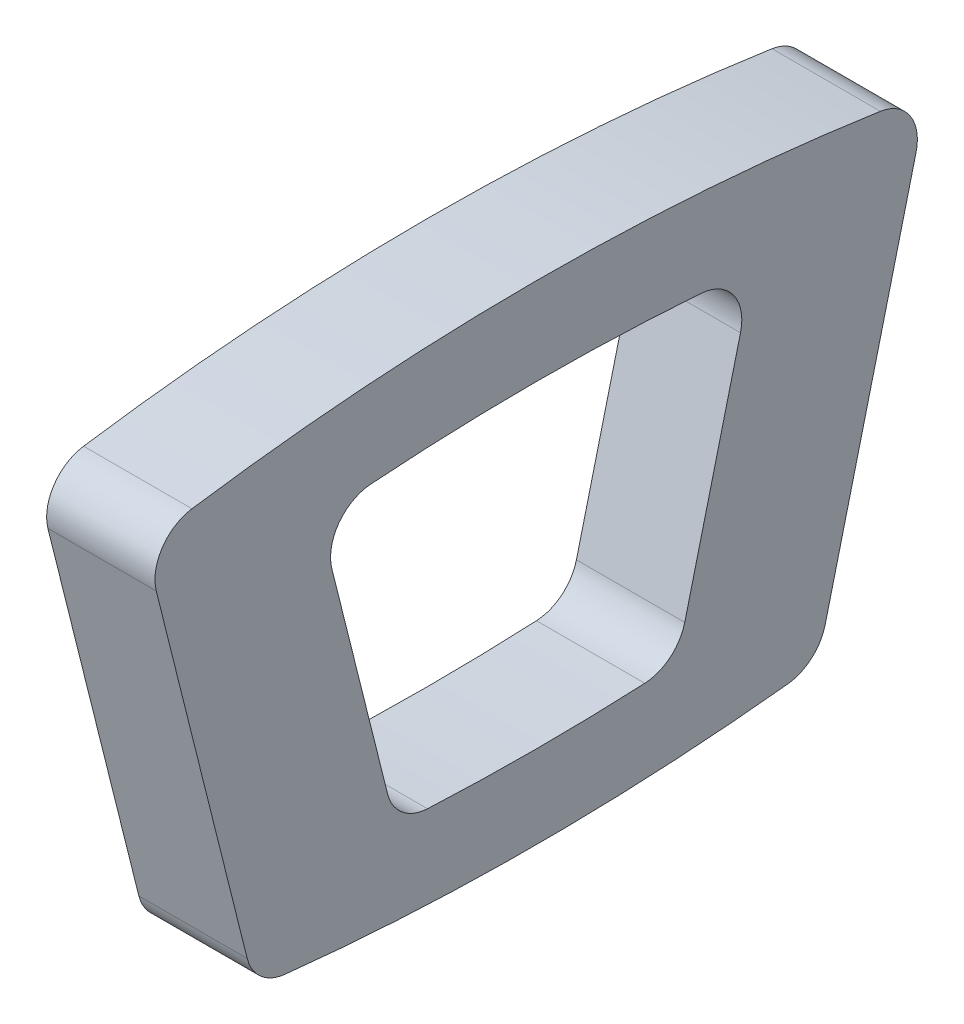
ISO-10303-21;
HEADER;
FILE_DESCRIPTION(('STEP AP214'),'2;1');
FILE_NAME('part.step','',(''),(''),'','','');
FILE_SCHEMA(('AUTOMOTIVE_DESIGN { 1 0 10303 214 1 1 1 1 }'));
ENDSEC;
DATA;
#1=APPLICATION_CONTEXT('core data for automotive mechanical design processes');
#2=APPLICATION_PROTOCOL_DEFINITION('international standard','automotive_design',2000,#1);
#3=PRODUCT_CONTEXT('',#1,'mechanical');
#4=PRODUCT('Part','Part','',(#3));
#5=PRODUCT_RELATED_PRODUCT_CATEGORY('part','',(#4));
#6=PRODUCT_DEFINITION_FORMATION('','',#4);
#7=PRODUCT_DEFINITION_CONTEXT('part definition',#1,'design');
#8=PRODUCT_DEFINITION('design','',#6,#7);
#9=PRODUCT_DEFINITION_SHAPE('','',#8);
#10=(LENGTH_UNIT() NAMED_UNIT(*) SI_UNIT(.MILLI.,.METRE.));
#11=(NAMED_UNIT(*) PLANE_ANGLE_UNIT() SI_UNIT($,.RADIAN.));
#12=(NAMED_UNIT(*) SI_UNIT($,.STERADIAN.) SOLID_ANGLE_UNIT());
#13=UNCERTAINTY_MEASURE_WITH_UNIT(LENGTH_MEASURE(1.E-05),#10,'distance_accuracy_value','');
#14=(GEOMETRIC_REPRESENTATION_CONTEXT(3) GLOBAL_UNCERTAINTY_ASSIGNED_CONTEXT((#13)) GLOBAL_UNIT_ASSIGNED_CONTEXT((#10,
#11,#12)) REPRESENTATION_CONTEXT('',''));
#15=CARTESIAN_POINT('',(0.,0.,0.));
#16=DIRECTION('',(0.,0.,1.));
#17=DIRECTION('',(1.,0.,0.));
#18=AXIS2_PLACEMENT_3D('',#15,#16,#17);
#19=CARTESIAN_POINT('',(10.,177.159717930252,-22.7918238569453));
#20=DIRECTION('',(1.,0.,0.));
#21=DIRECTION('',(0.,0.,-1.));
#22=AXIS2_PLACEMENT_3D('',#19,#20,#21);
#23=PLANE('',#22);
#24=CARTESIAN_POINT('',(10.,177.159717930252,-22.7918238569453));
#25=DIRECTION('',(1.,0.,0.));
#26=DIRECTION('',(0.,0.,-1.));
#27=AXIS2_PLACEMENT_3D('',#24,#25,#26);
#28=CIRCLE('',#27,4.00000000000001);
#29=CARTESIAN_POINT('',(10.,173.182678406543,-23.2197918777813));
#30=VERTEX_POINT('',#29);
#31=CARTESIAN_POINT('',(10.,176.189575430106,-26.6723938575266));
#32=VERTEX_POINT('',#31);
#33=EDGE_CURVE('E222',#30,#32,#28,.T.);
#34=ORIENTED_EDGE('',*,*,#33,.T.);
#35=DIRECTION('',(0.,0.970142500145332,-0.242535625036332));
#36=VECTOR('',#35,1.);
#37=CARTESIAN_POINT('',(10.,176.189575430106,-26.6723938575266));
#38=LINE('',#37,#36);
#39=CARTESIAN_POINT('',(10.,209.758625875981,-35.0646564689952));
#40=VERTEX_POINT('',#39);
#41=EDGE_CURVE('E225',#32,#40,#38,.T.);
#42=ORIENTED_EDGE('',*,*,#41,.T.);
#43=CARTESIAN_POINT('',(10.,210.728768376126,-31.1840864684138));
#44=DIRECTION('',(1.,0.,0.));
#45=DIRECTION('',(0.,0.,1.));
#46=AXIS2_PLACEMENT_3D('',#43,#44,#45);
#47=CIRCLE('',#46,4.00000000000003);
#48=CARTESIAN_POINT('',(10.,214.685677419528,-31.7696381930689));
#49=VERTEX_POINT('',#48);
#50=EDGE_CURVE('E227',#40,#49,#47,.T.);
#51=ORIENTED_EDGE('',*,*,#50,.T.);
#52=CARTESIAN_POINT('',(10.,0.,0.));
#53=DIRECTION('',(1.,0.,0.));
#54=DIRECTION('',(0.,0.,1.));
#55=AXIS2_PLACEMENT_3D('',#52,#53,#54);
#56=CIRCLE('',#55,217.023616226437);
#57=CARTESIAN_POINT('',(10.,214.685677419528,31.7696381930689));
#58=VERTEX_POINT('',#57);
#59=EDGE_CURVE('E229',#49,#58,#56,.T.);
#60=ORIENTED_EDGE('',*,*,#59,.T.);
#61=CARTESIAN_POINT('',(10.,210.728768376126,31.1840864684138));
#62=DIRECTION('',(1.,0.,0.));
#63=DIRECTION('',(0.,0.,1.));
#64=AXIS2_PLACEMENT_3D('',#61,#62,#63);
#65=CIRCLE('',#64,4.00000000000002);
#66=CARTESIAN_POINT('',(10.,209.758625875981,35.0646564689952));
#67=VERTEX_POINT('',#66);
#68=EDGE_CURVE('E231',#58,#67,#65,.T.);
#69=ORIENTED_EDGE('',*,*,#68,.T.);
#70=DIRECTION('',(0.,-0.970142500145332,-0.242535625036332));
#71=VECTOR('',#70,1.);
#72=CARTESIAN_POINT('',(10.,176.189575430106,26.6723938575266));
#73=LINE('',#72,#71);
#74=CARTESIAN_POINT('',(10.,176.189575430106,26.6723938575266));
#75=VERTEX_POINT('',#74);
#76=EDGE_CURVE('E233',#67,#75,#73,.T.);
#77=ORIENTED_EDGE('',*,*,#76,.T.);
#78=CARTESIAN_POINT('',(10.,177.159717930252,22.7918238569453));
#79=DIRECTION('',(1.,0.,0.));
#80=DIRECTION('',(0.,0.,-1.));
#81=AXIS2_PLACEMENT_3D('',#78,#79,#80);
#82=CIRCLE('',#81,4.00000000000001);
#83=CARTESIAN_POINT('',(10.,173.182678406543,23.2197918777813));
#84=VERTEX_POINT('',#83);
#85=EDGE_CURVE('E235',#75,#84,#82,.T.);
#86=ORIENTED_EDGE('',*,*,#85,.T.);
#87=CARTESIAN_POINT('',(10.,388.960553234229,0.));
#88=DIRECTION('',(1.,0.,0.));
#89=DIRECTION('',(0.,0.,-1.));
#90=AXIS2_PLACEMENT_3D('',#87,#88,#89);
#91=CIRCLE('',#90,217.023616226437);
#92=EDGE_CURVE('E237',#84,#30,#91,.T.);
#93=ORIENTED_EDGE('',*,*,#92,.T.);
#94=EDGE_LOOP('',(#34,#42,#51,#60,#69,#77,#86,#93));
#95=FACE_BOUND('',#94,.T.);
#96=DIRECTION('',(0.,0.970142500145332,-0.242535625036333));
#97=VECTOR('',#96,1.);
#98=CARTESIAN_POINT('',(10.,182.861170071266,-13.7152925178166));
#99=LINE('',#98,#97);
#100=CARTESIAN_POINT('',(10.,182.861170071266,-13.7152925178166));
#101=VERTEX_POINT('',#100);
#102=CARTESIAN_POINT('',(10.,203.441046598239,-18.8602616495598));
#103=VERTEX_POINT('',#102);
#104=EDGE_CURVE('E180',#101,#103,#99,.T.);
#105=ORIENTED_EDGE('',*,*,#104,.F.);
#106=CARTESIAN_POINT('',(10.,183.831312571412,-9.83472251723527));
#107=DIRECTION('',(1.,0.,0.));
#108=DIRECTION('',(0.,0.,-1.));
#109=AXIS2_PLACEMENT_3D('',#106,#107,#108);
#110=CIRCLE('',#109,3.99999999999998);
#111=CARTESIAN_POINT('',(10.,179.83592011072,-10.0266576235856));
#112=VERTEX_POINT('',#111);
#113=EDGE_CURVE('E157',#112,#101,#110,.T.);
#114=ORIENTED_EDGE('',*,*,#113,.F.);
#115=CARTESIAN_POINT('',(10.,388.554549219143,0.));
#116=DIRECTION('',(1.,0.,0.));
#117=DIRECTION('',(0.,0.,-1.));
#118=AXIS2_PLACEMENT_3D('',#115,#116,#117);
#119=CIRCLE('',#118,208.959326185744);
#120=CARTESIAN_POINT('',(10.,179.83592011072,10.0266576235856));
#121=VERTEX_POINT('',#120);
#122=EDGE_CURVE('E192',#121,#112,#119,.T.);
#123=ORIENTED_EDGE('',*,*,#122,.F.);
#124=CARTESIAN_POINT('',(10.,183.831312571412,9.83472251723527));
#125=DIRECTION('',(1.,0.,0.));
#126=DIRECTION('',(0.,0.,-1.));
#127=AXIS2_PLACEMENT_3D('',#124,#125,#126);
#128=CIRCLE('',#127,3.99999999999998);
#129=CARTESIAN_POINT('',(10.,182.861170071266,13.7152925178166));
#130=VERTEX_POINT('',#129);
#131=EDGE_CURVE('E190',#130,#121,#128,.T.);
#132=ORIENTED_EDGE('',*,*,#131,.F.);
#133=DIRECTION('',(0.,-0.970142500145332,-0.242535625036333));
#134=VECTOR('',#133,1.);
#135=CARTESIAN_POINT('',(10.,182.861170071266,13.7152925178166));
#136=LINE('',#135,#134);
#137=CARTESIAN_POINT('',(10.,203.441046598239,18.8602616495598));
#138=VERTEX_POINT('',#137);
#139=EDGE_CURVE('E188',#138,#130,#136,.T.);
#140=ORIENTED_EDGE('',*,*,#139,.F.);
#141=CARTESIAN_POINT('',(10.,204.411189098385,14.9796916489785));
#142=DIRECTION('',(1.,0.,0.));
#143=DIRECTION('',(0.,0.,1.));
#144=AXIS2_PLACEMENT_3D('',#141,#142,#143);
#145=CIRCLE('',#144,4.00000000000002);
#146=CARTESIAN_POINT('',(10.,208.400491618108,15.2720363190698));
#147=VERTEX_POINT('',#146);
#148=EDGE_CURVE('E186',#147,#138,#145,.T.);
#149=ORIENTED_EDGE('',*,*,#148,.F.);
#150=CARTESIAN_POINT('',(10.,0.,0.));
#151=DIRECTION('',(1.,0.,0.));
#152=DIRECTION('',(0.,0.,1.));
#153=AXIS2_PLACEMENT_3D('',#150,#151,#152);
#154=CIRCLE('',#153,208.959326185744);
#155=CARTESIAN_POINT('',(10.,208.400491618108,-15.2720363190698));
#156=VERTEX_POINT('',#155);
#157=EDGE_CURVE('E184',#156,#147,#154,.T.);
#158=ORIENTED_EDGE('',*,*,#157,.F.);
#159=CARTESIAN_POINT('',(10.,204.411189098385,-14.9796916489785));
#160=DIRECTION('',(1.,0.,0.));
#161=DIRECTION('',(0.,0.,1.));
#162=AXIS2_PLACEMENT_3D('',#159,#160,#161);
#163=CIRCLE('',#162,4.00000000000002);
#164=EDGE_CURVE('E182',#103,#156,#163,.T.);
#165=ORIENTED_EDGE('',*,*,#164,.F.);
#166=EDGE_LOOP('',(#105,#114,#123,#132,#140,#149,#158,#165));
#167=FACE_BOUND('',#166,.T.);
#168=ADVANCED_FACE('F29',(#95,#167),#23,.T.);
#169=CARTESIAN_POINT('',(0.,177.159717930252,-22.7918238569453));
#170=DIRECTION('',(1.,0.,0.));
#171=DIRECTION('',(0.,0.,-1.));
#172=AXIS2_PLACEMENT_3D('',#169,#170,#171);
#173=PLANE('',#172);
#174=CARTESIAN_POINT('',(0.,177.159717930252,-22.7918238569453));
#175=DIRECTION('',(1.,0.,0.));
#176=DIRECTION('',(0.,0.,-1.));
#177=AXIS2_PLACEMENT_3D('',#174,#175,#176);
#178=CIRCLE('',#177,4.00000000000001);
#179=CARTESIAN_POINT('',(0.,173.182678406543,-23.2197918777813));
#180=VERTEX_POINT('',#179);
#181=CARTESIAN_POINT('',(0.,176.189575430106,-26.6723938575266));
#182=VERTEX_POINT('',#181);
#183=EDGE_CURVE('E158',#180,#182,#178,.T.);
#184=ORIENTED_EDGE('',*,*,#183,.F.);
#185=CARTESIAN_POINT('',(0.,388.960553234229,0.));
#186=DIRECTION('',(1.,0.,0.));
#187=DIRECTION('',(0.,0.,-1.));
#188=AXIS2_PLACEMENT_3D('',#185,#186,#187);
#189=CIRCLE('',#188,217.023616226437);
#190=CARTESIAN_POINT('',(0.,173.182678406543,23.2197918777813));
#191=VERTEX_POINT('',#190);
#192=EDGE_CURVE('E220',#191,#180,#189,.T.);
#193=ORIENTED_EDGE('',*,*,#192,.F.);
#194=CARTESIAN_POINT('',(0.,177.159717930252,22.7918238569453));
#195=DIRECTION('',(1.,0.,0.));
#196=DIRECTION('',(0.,0.,-1.));
#197=AXIS2_PLACEMENT_3D('',#194,#195,#196);
#198=CIRCLE('',#197,4.00000000000001);
#199=CARTESIAN_POINT('',(0.,176.189575430106,26.6723938575266));
#200=VERTEX_POINT('',#199);
#201=EDGE_CURVE('E218',#200,#191,#198,.T.);
#202=ORIENTED_EDGE('',*,*,#201,.F.);
#203=DIRECTION('',(0.,-0.970142500145332,-0.242535625036332));
#204=VECTOR('',#203,1.);
#205=CARTESIAN_POINT('',(0.,176.189575430106,26.6723938575266));
#206=LINE('',#205,#204);
#207=CARTESIAN_POINT('',(0.,209.758625875981,35.0646564689952));
#208=VERTEX_POINT('',#207);
#209=EDGE_CURVE('E216',#208,#200,#206,.T.);
#210=ORIENTED_EDGE('',*,*,#209,.F.);
#211=CARTESIAN_POINT('',(0.,210.728768376126,31.1840864684138));
#212=DIRECTION('',(1.,0.,0.));
#213=DIRECTION('',(0.,0.,1.));
#214=AXIS2_PLACEMENT_3D('',#211,#212,#213);
#215=CIRCLE('',#214,4.00000000000002);
#216=CARTESIAN_POINT('',(0.,214.685677419528,31.7696381930689));
#217=VERTEX_POINT('',#216);
#218=EDGE_CURVE('E214',#217,#208,#215,.T.);
#219=ORIENTED_EDGE('',*,*,#218,.F.);
#220=CARTESIAN_POINT('',(0.,0.,0.));
#221=DIRECTION('',(1.,0.,0.));
#222=DIRECTION('',(0.,0.,1.));
#223=AXIS2_PLACEMENT_3D('',#220,#221,#222);
#224=CIRCLE('',#223,217.023616226437);
#225=CARTESIAN_POINT('',(0.,214.685677419528,-31.7696381930689));
#226=VERTEX_POINT('',#225);
#227=EDGE_CURVE('E212',#226,#217,#224,.T.);
#228=ORIENTED_EDGE('',*,*,#227,.F.);
#229=CARTESIAN_POINT('',(0.,210.728768376126,-31.1840864684138));
#230=DIRECTION('',(1.,0.,0.));
#231=DIRECTION('',(0.,0.,1.));
#232=AXIS2_PLACEMENT_3D('',#229,#230,#231);
#233=CIRCLE('',#232,4.00000000000003);
#234=CARTESIAN_POINT('',(0.,209.758625875981,-35.0646564689952));
#235=VERTEX_POINT('',#234);
#236=EDGE_CURVE('E210',#235,#226,#233,.T.);
#237=ORIENTED_EDGE('',*,*,#236,.F.);
#238=DIRECTION('',(0.,0.970142500145332,-0.242535625036332));
#239=VECTOR('',#238,1.);
#240=CARTESIAN_POINT('',(0.,176.189575430106,-26.6723938575266));
#241=LINE('',#240,#239);
#242=EDGE_CURVE('E208',#182,#235,#241,.T.);
#243=ORIENTED_EDGE('',*,*,#242,.F.);
#244=EDGE_LOOP('',(#184,#193,#202,#210,#219,#228,#237,#243));
#245=FACE_BOUND('',#244,.T.);
#246=CARTESIAN_POINT('',(0.,183.831312571412,-9.83472251723527));
#247=DIRECTION('',(1.,0.,0.));
#248=DIRECTION('',(0.,0.,-1.));
#249=AXIS2_PLACEMENT_3D('',#246,#247,#248);
#250=CIRCLE('',#249,3.99999999999998);
#251=CARTESIAN_POINT('',(0.,179.83592011072,-10.0266576235856));
#252=VERTEX_POINT('',#251);
#253=CARTESIAN_POINT('',(0.,182.861170071266,-13.7152925178166));
#254=VERTEX_POINT('',#253);
#255=EDGE_CURVE('E52',#252,#254,#250,.T.);
#256=ORIENTED_EDGE('',*,*,#255,.T.);
#257=DIRECTION('',(0.,0.970142500145332,-0.242535625036333));
#258=VECTOR('',#257,1.);
#259=CARTESIAN_POINT('',(0.,182.861170071266,-13.7152925178166));
#260=LINE('',#259,#258);
#261=CARTESIAN_POINT('',(0.,203.441046598239,-18.8602616495598));
#262=VERTEX_POINT('',#261);
#263=EDGE_CURVE('E144',#254,#262,#260,.T.);
#264=ORIENTED_EDGE('',*,*,#263,.T.);
#265=CARTESIAN_POINT('',(0.,204.411189098385,-14.9796916489785));
#266=DIRECTION('',(1.,0.,0.));
#267=DIRECTION('',(0.,0.,1.));
#268=AXIS2_PLACEMENT_3D('',#265,#266,#267);
#269=CIRCLE('',#268,4.00000000000002);
#270=CARTESIAN_POINT('',(0.,208.400491618108,-15.2720363190698));
#271=VERTEX_POINT('',#270);
#272=EDGE_CURVE('E153',#262,#271,#269,.T.);
#273=ORIENTED_EDGE('',*,*,#272,.T.);
#274=CARTESIAN_POINT('',(0.,0.,0.));
#275=DIRECTION('',(1.,0.,0.));
#276=DIRECTION('',(0.,0.,1.));
#277=AXIS2_PLACEMENT_3D('',#274,#275,#276);
#278=CIRCLE('',#277,208.959326185744);
#279=CARTESIAN_POINT('',(0.,208.400491618108,15.2720363190698));
#280=VERTEX_POINT('',#279);
#281=EDGE_CURVE('E167',#271,#280,#278,.T.);
#282=ORIENTED_EDGE('',*,*,#281,.T.);
#283=CARTESIAN_POINT('',(0.,204.411189098385,14.9796916489785));
#284=DIRECTION('',(1.,0.,0.));
#285=DIRECTION('',(0.,0.,1.));
#286=AXIS2_PLACEMENT_3D('',#283,#284,#285);
#287=CIRCLE('',#286,4.00000000000002);
#288=CARTESIAN_POINT('',(0.,203.441046598239,18.8602616495598));
#289=VERTEX_POINT('',#288);
#290=EDGE_CURVE('E170',#280,#289,#287,.T.);
#291=ORIENTED_EDGE('',*,*,#290,.T.);
#292=DIRECTION('',(0.,-0.970142500145332,-0.242535625036333));
#293=VECTOR('',#292,1.);
#294=CARTESIAN_POINT('',(0.,182.861170071266,13.7152925178166));
#295=LINE('',#294,#293);
#296=CARTESIAN_POINT('',(0.,182.861170071266,13.7152925178166));
#297=VERTEX_POINT('',#296);
#298=EDGE_CURVE('E173',#289,#297,#295,.T.);
#299=ORIENTED_EDGE('',*,*,#298,.T.);
#300=CARTESIAN_POINT('',(0.,183.831312571412,9.83472251723527));
#301=DIRECTION('',(1.,0.,0.));
#302=DIRECTION('',(0.,0.,-1.));
#303=AXIS2_PLACEMENT_3D('',#300,#301,#302);
#304=CIRCLE('',#303,3.99999999999998);
#305=CARTESIAN_POINT('',(0.,179.83592011072,10.0266576235856));
#306=VERTEX_POINT('',#305);
#307=EDGE_CURVE('E176',#297,#306,#304,.T.);
#308=ORIENTED_EDGE('',*,*,#307,.T.);
#309=CARTESIAN_POINT('',(0.,388.554549219143,0.));
#310=DIRECTION('',(1.,0.,0.));
#311=DIRECTION('',(0.,0.,-1.));
#312=AXIS2_PLACEMENT_3D('',#309,#310,#311);
#313=CIRCLE('',#312,208.959326185744);
#314=EDGE_CURVE('E163',#306,#252,#313,.T.);
#315=ORIENTED_EDGE('',*,*,#314,.T.);
#316=EDGE_LOOP('',(#256,#264,#273,#282,#291,#299,#308,#315));
#317=FACE_BOUND('',#316,.T.);
#318=ADVANCED_FACE('F161',(#245,#317),#173,.F.);
#319=CARTESIAN_POINT('',(10.,177.159717930252,-22.7918238569453));
#320=DIRECTION('',(-1.,0.,0.));
#321=DIRECTION('',(0.,0.,1.));
#322=AXIS2_PLACEMENT_3D('',#319,#320,#321);
#323=CYLINDRICAL_SURFACE('',#322,4.00000000000001);
#324=ORIENTED_EDGE('',*,*,#183,.T.);
#325=DIRECTION('',(-1.,0.,0.));
#326=VECTOR('',#325,1.);
#327=CARTESIAN_POINT('',(10.,176.189575430106,-26.6723938575266));
#328=LINE('',#327,#326);
#329=EDGE_CURVE('E11',#32,#182,#328,.T.);
#330=ORIENTED_EDGE('',*,*,#329,.F.);
#331=ORIENTED_EDGE('',*,*,#33,.F.);
#332=DIRECTION('',(-1.,0.,0.));
#333=VECTOR('',#332,1.);
#334=CARTESIAN_POINT('',(10.,173.182678406543,-23.2197918777813));
#335=LINE('',#334,#333);
#336=EDGE_CURVE('E239',#30,#180,#335,.T.);
#337=ORIENTED_EDGE('',*,*,#336,.T.);
#338=EDGE_LOOP('',(#324,#330,#331,#337));
#339=FACE_BOUND('',#338,.T.);
#340=ADVANCED_FACE('F31',(#339),#323,.T.);
#341=CARTESIAN_POINT('',(10.,176.189575430106,-26.6723938575266));
#342=DIRECTION('',(0.,0.242535625036333,0.970142500145332));
#343=DIRECTION('',(0.,-0.970142500145332,0.242535625036333));
#344=AXIS2_PLACEMENT_3D('',#341,#342,#343);
#345=PLANE('',#344);
#346=ORIENTED_EDGE('',*,*,#242,.T.);
#347=DIRECTION('',(-1.,0.,0.));
#348=VECTOR('',#347,1.);
#349=CARTESIAN_POINT('',(10.,209.758625875981,-35.0646564689952));
#350=LINE('',#349,#348);
#351=EDGE_CURVE('E37',#40,#235,#350,.T.);
#352=ORIENTED_EDGE('',*,*,#351,.F.);
#353=ORIENTED_EDGE('',*,*,#41,.F.);
#354=ORIENTED_EDGE('',*,*,#329,.T.);
#355=EDGE_LOOP('',(#346,#352,#353,#354));
#356=FACE_BOUND('',#355,.T.);
#357=ADVANCED_FACE('F283',(#356),#345,.F.);
#358=CARTESIAN_POINT('',(10.,210.728768376126,-31.1840864684138));
#359=DIRECTION('',(-1.,0.,0.));
#360=DIRECTION('',(0.,0.,1.));
#361=AXIS2_PLACEMENT_3D('',#358,#359,#360);
#362=CYLINDRICAL_SURFACE('',#361,4.00000000000003);
#363=ORIENTED_EDGE('',*,*,#236,.T.);
#364=DIRECTION('',(-1.,0.,0.));
#365=VECTOR('',#364,1.);
#366=CARTESIAN_POINT('',(10.,214.685677419528,-31.7696381930689));
#367=LINE('',#366,#365);
#368=EDGE_CURVE('E254',#49,#226,#367,.T.);
#369=ORIENTED_EDGE('',*,*,#368,.F.);
#370=ORIENTED_EDGE('',*,*,#50,.F.);
#371=ORIENTED_EDGE('',*,*,#351,.T.);
#372=EDGE_LOOP('',(#363,#369,#370,#371));
#373=FACE_BOUND('',#372,.T.);
#374=ADVANCED_FACE('F261',(#373),#362,.T.);
#375=CARTESIAN_POINT('',(10.,0.,0.));
#376=DIRECTION('',(-1.,0.,0.));
#377=DIRECTION('',(0.,0.,1.));
#378=AXIS2_PLACEMENT_3D('',#375,#376,#377);
#379=CYLINDRICAL_SURFACE('',#378,217.023616226437);
#380=ORIENTED_EDGE('',*,*,#227,.T.);
#381=DIRECTION('',(-1.,0.,0.));
#382=VECTOR('',#381,1.);
#383=CARTESIAN_POINT('',(10.,214.685677419528,31.7696381930689));
#384=LINE('',#383,#382);
#385=EDGE_CURVE('E251',#58,#217,#384,.T.);
#386=ORIENTED_EDGE('',*,*,#385,.F.);
#387=ORIENTED_EDGE('',*,*,#59,.F.);
#388=ORIENTED_EDGE('',*,*,#368,.T.);
#389=EDGE_LOOP('',(#380,#386,#387,#388));
#390=FACE_BOUND('',#389,.T.);
#391=ADVANCED_FACE('F271',(#390),#379,.T.);
#392=CARTESIAN_POINT('',(10.,210.728768376126,31.1840864684138));
#393=DIRECTION('',(-1.,0.,0.));
#394=DIRECTION('',(0.,0.,1.));
#395=AXIS2_PLACEMENT_3D('',#392,#393,#394);
#396=CYLINDRICAL_SURFACE('',#395,4.00000000000002);
#397=ORIENTED_EDGE('',*,*,#218,.T.);
#398=DIRECTION('',(-1.,0.,0.));
#399=VECTOR('',#398,1.);
#400=CARTESIAN_POINT('',(10.,209.758625875981,35.0646564689952));
#401=LINE('',#400,#399);
#402=EDGE_CURVE('E248',#67,#208,#401,.T.);
#403=ORIENTED_EDGE('',*,*,#402,.F.);
#404=ORIENTED_EDGE('',*,*,#68,.F.);
#405=ORIENTED_EDGE('',*,*,#385,.T.);
#406=EDGE_LOOP('',(#397,#403,#404,#405));
#407=FACE_BOUND('',#406,.T.);
#408=ADVANCED_FACE('F275',(#407),#396,.T.);
#409=CARTESIAN_POINT('',(10.,176.189575430106,26.6723938575266));
#410=DIRECTION('',(0.,0.242535625036332,-0.970142500145332));
#411=DIRECTION('',(0.,0.970142500145332,0.242535625036332));
#412=AXIS2_PLACEMENT_3D('',#409,#410,#411);
#413=PLANE('',#412);
#414=ORIENTED_EDGE('',*,*,#209,.T.);
#415=DIRECTION('',(-1.,0.,0.));
#416=VECTOR('',#415,1.);
#417=CARTESIAN_POINT('',(10.,176.189575430106,26.6723938575266));
#418=LINE('',#417,#416);
#419=EDGE_CURVE('E245',#75,#200,#418,.T.);
#420=ORIENTED_EDGE('',*,*,#419,.F.);
#421=ORIENTED_EDGE('',*,*,#76,.F.);
#422=ORIENTED_EDGE('',*,*,#402,.T.);
#423=EDGE_LOOP('',(#414,#420,#421,#422));
#424=FACE_BOUND('',#423,.T.);
#425=ADVANCED_FACE('F296',(#424),#413,.F.);
#426=CARTESIAN_POINT('',(10.,177.159717930252,22.7918238569453));
#427=DIRECTION('',(-1.,0.,0.));
#428=DIRECTION('',(0.,0.,1.));
#429=AXIS2_PLACEMENT_3D('',#426,#427,#428);
#430=CYLINDRICAL_SURFACE('',#429,4.00000000000001);
#431=ORIENTED_EDGE('',*,*,#201,.T.);
#432=DIRECTION('',(-1.,0.,0.));
#433=VECTOR('',#432,1.);
#434=CARTESIAN_POINT('',(10.,173.182678406543,23.2197918777813));
#435=LINE('',#434,#433);
#436=EDGE_CURVE('E242',#84,#191,#435,.T.);
#437=ORIENTED_EDGE('',*,*,#436,.F.);
#438=ORIENTED_EDGE('',*,*,#85,.F.);
#439=ORIENTED_EDGE('',*,*,#419,.T.);
#440=EDGE_LOOP('',(#431,#437,#438,#439));
#441=FACE_BOUND('',#440,.T.);
#442=ADVANCED_FACE('F294',(#441),#430,.T.);
#443=CARTESIAN_POINT('',(10.,388.960553234229,0.));
#444=DIRECTION('',(-1.,0.,0.));
#445=DIRECTION('',(0.,0.,1.));
#446=AXIS2_PLACEMENT_3D('',#443,#444,#445);
#447=CYLINDRICAL_SURFACE('',#446,217.023616226437);
#448=ORIENTED_EDGE('',*,*,#192,.T.);
#449=ORIENTED_EDGE('',*,*,#336,.F.);
#450=ORIENTED_EDGE('',*,*,#92,.F.);
#451=ORIENTED_EDGE('',*,*,#436,.T.);
#452=EDGE_LOOP('',(#448,#449,#450,#451));
#453=FACE_BOUND('',#452,.T.);
#454=ADVANCED_FACE('F289',(#453),#447,.T.);
#455=CARTESIAN_POINT('',(10.,183.831312571412,-9.83472251723527));
#456=DIRECTION('',(-1.,0.,0.));
#457=DIRECTION('',(0.,0.,1.));
#458=AXIS2_PLACEMENT_3D('',#455,#456,#457);
#459=CYLINDRICAL_SURFACE('',#458,3.99999999999998);
#460=ORIENTED_EDGE('',*,*,#255,.F.);
#461=DIRECTION('',(-1.,0.,0.));
#462=VECTOR('',#461,1.);
#463=CARTESIAN_POINT('',(10.,179.83592011072,-10.0266576235856));
#464=LINE('',#463,#462);
#465=EDGE_CURVE('E194',#112,#252,#464,.T.);
#466=ORIENTED_EDGE('',*,*,#465,.F.);
#467=ORIENTED_EDGE('',*,*,#113,.T.);
#468=DIRECTION('',(-1.,0.,0.));
#469=VECTOR('',#468,1.);
#470=CARTESIAN_POINT('',(10.,182.861170071266,-13.7152925178166));
#471=LINE('',#470,#469);
#472=EDGE_CURVE('E146',#101,#254,#471,.T.);
#473=ORIENTED_EDGE('',*,*,#472,.T.);
#474=EDGE_LOOP('',(#460,#466,#467,#473));
#475=FACE_BOUND('',#474,.T.);
#476=ADVANCED_FACE('F155',(#475),#459,.F.);
#477=CARTESIAN_POINT('',(10.,182.861170071266,-13.7152925178166));
#478=DIRECTION('',(0.,0.242535625036333,0.970142500145332));
#479=DIRECTION('',(0.,-0.970142500145332,0.242535625036333));
#480=AXIS2_PLACEMENT_3D('',#477,#478,#479);
#481=PLANE('',#480);
#482=ORIENTED_EDGE('',*,*,#263,.F.);
#483=ORIENTED_EDGE('',*,*,#472,.F.);
#484=ORIENTED_EDGE('',*,*,#104,.T.);
#485=DIRECTION('',(-1.,0.,0.));
#486=VECTOR('',#485,1.);
#487=CARTESIAN_POINT('',(10.,203.441046598239,-18.8602616495598));
#488=LINE('',#487,#486);
#489=EDGE_CURVE('E149',#103,#262,#488,.T.);
#490=ORIENTED_EDGE('',*,*,#489,.T.);
#491=EDGE_LOOP('',(#482,#483,#484,#490));
#492=FACE_BOUND('',#491,.T.);
#493=ADVANCED_FACE('F145',(#492),#481,.T.);
#494=CARTESIAN_POINT('',(10.,204.411189098385,-14.9796916489785));
#495=DIRECTION('',(-1.,0.,0.));
#496=DIRECTION('',(0.,0.,1.));
#497=AXIS2_PLACEMENT_3D('',#494,#495,#496);
#498=CYLINDRICAL_SURFACE('',#497,4.00000000000002);
#499=ORIENTED_EDGE('',*,*,#272,.F.);
#500=ORIENTED_EDGE('',*,*,#489,.F.);
#501=ORIENTED_EDGE('',*,*,#164,.T.);
#502=DIRECTION('',(-1.,0.,0.));
#503=VECTOR('',#502,1.);
#504=CARTESIAN_POINT('',(10.,208.400491618108,-15.2720363190698));
#505=LINE('',#504,#503);
#506=EDGE_CURVE('E203',#156,#271,#505,.T.);
#507=ORIENTED_EDGE('',*,*,#506,.T.);
#508=EDGE_LOOP('',(#499,#500,#501,#507));
#509=FACE_BOUND('',#508,.T.);
#510=ADVANCED_FACE('F320',(#509),#498,.F.);
#511=CARTESIAN_POINT('',(10.,0.,0.));
#512=DIRECTION('',(-1.,0.,0.));
#513=DIRECTION('',(0.,0.,1.));
#514=AXIS2_PLACEMENT_3D('',#511,#512,#513);
#515=CYLINDRICAL_SURFACE('',#514,208.959326185744);
#516=ORIENTED_EDGE('',*,*,#281,.F.);
#517=ORIENTED_EDGE('',*,*,#506,.F.);
#518=ORIENTED_EDGE('',*,*,#157,.T.);
#519=DIRECTION('',(-1.,0.,0.));
#520=VECTOR('',#519,1.);
#521=CARTESIAN_POINT('',(10.,208.400491618108,15.2720363190698));
#522=LINE('',#521,#520);
#523=EDGE_CURVE('E201',#147,#280,#522,.T.);
#524=ORIENTED_EDGE('',*,*,#523,.T.);
#525=EDGE_LOOP('',(#516,#517,#518,#524));
#526=FACE_BOUND('',#525,.T.);
#527=ADVANCED_FACE('F325',(#526),#515,.F.);
#528=CARTESIAN_POINT('',(10.,204.411189098385,14.9796916489785));
#529=DIRECTION('',(-1.,0.,0.));
#530=DIRECTION('',(0.,0.,1.));
#531=AXIS2_PLACEMENT_3D('',#528,#529,#530);
#532=CYLINDRICAL_SURFACE('',#531,4.00000000000002);
#533=ORIENTED_EDGE('',*,*,#290,.F.);
#534=ORIENTED_EDGE('',*,*,#523,.F.);
#535=ORIENTED_EDGE('',*,*,#148,.T.);
#536=DIRECTION('',(-1.,0.,0.));
#537=VECTOR('',#536,1.);
#538=CARTESIAN_POINT('',(10.,203.441046598239,18.8602616495598));
#539=LINE('',#538,#537);
#540=EDGE_CURVE('E199',#138,#289,#539,.T.);
#541=ORIENTED_EDGE('',*,*,#540,.T.);
#542=EDGE_LOOP('',(#533,#534,#535,#541));
#543=FACE_BOUND('',#542,.T.);
#544=ADVANCED_FACE('F329',(#543),#532,.F.);
#545=CARTESIAN_POINT('',(10.,182.861170071266,13.7152925178166));
#546=DIRECTION('',(0.,0.242535625036333,-0.970142500145332));
#547=DIRECTION('',(0.,0.970142500145332,0.242535625036333));
#548=AXIS2_PLACEMENT_3D('',#545,#546,#547);
#549=PLANE('',#548);
#550=ORIENTED_EDGE('',*,*,#298,.F.);
#551=ORIENTED_EDGE('',*,*,#540,.F.);
#552=ORIENTED_EDGE('',*,*,#139,.T.);
#553=DIRECTION('',(-1.,0.,0.));
#554=VECTOR('',#553,1.);
#555=CARTESIAN_POINT('',(10.,182.861170071266,13.7152925178166));
#556=LINE('',#555,#554);
#557=EDGE_CURVE('E197',#130,#297,#556,.T.);
#558=ORIENTED_EDGE('',*,*,#557,.T.);
#559=EDGE_LOOP('',(#550,#551,#552,#558));
#560=FACE_BOUND('',#559,.T.);
#561=ADVANCED_FACE('F333',(#560),#549,.T.);
#562=CARTESIAN_POINT('',(10.,183.831312571412,9.83472251723527));
#563=DIRECTION('',(-1.,0.,0.));
#564=DIRECTION('',(0.,0.,1.));
#565=AXIS2_PLACEMENT_3D('',#562,#563,#564);
#566=CYLINDRICAL_SURFACE('',#565,3.99999999999998);
#567=ORIENTED_EDGE('',*,*,#307,.F.);
#568=ORIENTED_EDGE('',*,*,#557,.F.);
#569=ORIENTED_EDGE('',*,*,#131,.T.);
#570=DIRECTION('',(-1.,0.,0.));
#571=VECTOR('',#570,1.);
#572=CARTESIAN_POINT('',(10.,179.83592011072,10.0266576235856));
#573=LINE('',#572,#571);
#574=EDGE_CURVE('E44',#121,#306,#573,.T.);
#575=ORIENTED_EDGE('',*,*,#574,.T.);
#576=EDGE_LOOP('',(#567,#568,#569,#575));
#577=FACE_BOUND('',#576,.T.);
#578=ADVANCED_FACE('F337',(#577),#566,.F.);
#579=CARTESIAN_POINT('',(10.,388.554549219143,0.));
#580=DIRECTION('',(-1.,0.,0.));
#581=DIRECTION('',(0.,0.,1.));
#582=AXIS2_PLACEMENT_3D('',#579,#580,#581);
#583=CYLINDRICAL_SURFACE('',#582,208.959326185744);
#584=ORIENTED_EDGE('',*,*,#314,.F.);
#585=ORIENTED_EDGE('',*,*,#574,.F.);
#586=ORIENTED_EDGE('',*,*,#122,.T.);
#587=ORIENTED_EDGE('',*,*,#465,.T.);
#588=EDGE_LOOP('',(#584,#585,#586,#587));
#589=FACE_BOUND('',#588,.T.);
#590=ADVANCED_FACE('F341',(#589),#583,.F.);
#591=CLOSED_SHELL('',(#168,#318,#340,#357,#374,#391,#408,#425,#442,#454,#476,#493,#510,#527,
#544,#561,#578,#590));
#592=MANIFOLD_SOLID_BREP('B2',#591);
#593=ADVANCED_BREP_SHAPE_REPRESENTATION('',(#18,#592),#14);
#594=SHAPE_DEFINITION_REPRESENTATION(#9,#593);
ENDSEC;
END-ISO-10303-21;
